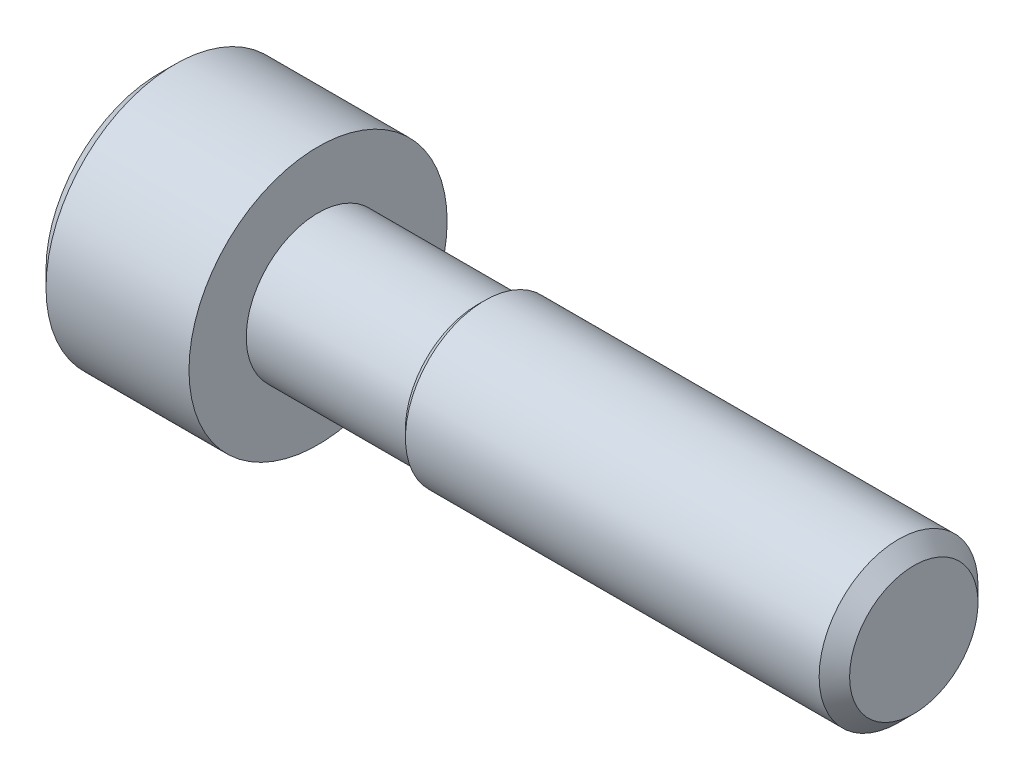
ISO-10303-21;
HEADER;
FILE_DESCRIPTION(('STEP AP214'),'2;1');
FILE_NAME('part.step','',(''),(''),'','','');
FILE_SCHEMA(('AUTOMOTIVE_DESIGN { 1 0 10303 214 1 1 1 1 }'));
ENDSEC;
DATA;
#1=APPLICATION_CONTEXT('core data for automotive mechanical design processes');
#2=APPLICATION_PROTOCOL_DEFINITION('international standard','automotive_design',2000,#1);
#3=PRODUCT_CONTEXT('',#1,'mechanical');
#4=PRODUCT('Part','Part','',(#3));
#5=PRODUCT_RELATED_PRODUCT_CATEGORY('part','',(#4));
#6=PRODUCT_DEFINITION_FORMATION('','',#4);
#7=PRODUCT_DEFINITION_CONTEXT('part definition',#1,'design');
#8=PRODUCT_DEFINITION('design','',#6,#7);
#9=PRODUCT_DEFINITION_SHAPE('','',#8);
#10=(LENGTH_UNIT() NAMED_UNIT(*) SI_UNIT(.MILLI.,.METRE.));
#11=(NAMED_UNIT(*) PLANE_ANGLE_UNIT() SI_UNIT($,.RADIAN.));
#12=(NAMED_UNIT(*) SI_UNIT($,.STERADIAN.) SOLID_ANGLE_UNIT());
#13=UNCERTAINTY_MEASURE_WITH_UNIT(LENGTH_MEASURE(1.E-05),#10,'distance_accuracy_value','');
#14=(GEOMETRIC_REPRESENTATION_CONTEXT(3) GLOBAL_UNCERTAINTY_ASSIGNED_CONTEXT((#13)) GLOBAL_UNIT_ASSIGNED_CONTEXT((#10,
#11,#12)) REPRESENTATION_CONTEXT('',''));
#15=CARTESIAN_POINT('',(0.,0.,0.));
#16=DIRECTION('',(0.,0.,1.));
#17=DIRECTION('',(1.,0.,0.));
#18=AXIS2_PLACEMENT_3D('',#15,#16,#17);
#19=CARTESIAN_POINT('',(-4.,0.,0.));
#20=DIRECTION('',(1.,0.,0.));
#21=DIRECTION('',(0.,0.,-1.));
#22=AXIS2_PLACEMENT_3D('',#19,#20,#21);
#23=PLANE('',#22);
#24=DIRECTION('',(0.,1.,0.));
#25=VECTOR('',#24,1.);
#26=CARTESIAN_POINT('',(-4.,0.,3.));
#27=LINE('',#26,#25);
#28=CARTESIAN_POINT('',(-4.,1.73205080756888,3.));
#29=VERTEX_POINT('',#28);
#30=CARTESIAN_POINT('',(-4.00000000000193,0.,3.00000000002137));
#31=VERTEX_POINT('',#30);
#32=EDGE_CURVE('E87',#29,#31,#27,.F.);
#33=ORIENTED_EDGE('',*,*,#32,.F.);
#34=DIRECTION('',(0.,-0.500000000000001,0.866025403784438));
#35=VECTOR('',#34,1.);
#36=CARTESIAN_POINT('',(-4.,2.59807621135332,1.5));
#37=LINE('',#36,#35);
#38=CARTESIAN_POINT('',(-4.00000000000193,2.59807621137183,1.50000000001069));
#39=VERTEX_POINT('',#38);
#40=EDGE_CURVE('E108',#39,#29,#37,.T.);
#41=ORIENTED_EDGE('',*,*,#40,.F.);
#42=CARTESIAN_POINT('',(-4.00000000000387,0.,0.));
#43=DIRECTION('',(-1.,0.,0.));
#44=DIRECTION('',(0.,0.,1.));
#45=AXIS2_PLACEMENT_3D('',#42,#43,#44);
#46=CIRCLE('',#45,3.00000000004275);
#47=EDGE_CURVE('E20',#39,#31,#46,.F.);
#48=ORIENTED_EDGE('',*,*,#47,.T.);
#49=EDGE_LOOP('',(#33,#41,#48));
#50=FACE_BOUND('',#49,.T.);
#51=ADVANCED_FACE('F17',(#50),#23,.F.);
#52=CARTESIAN_POINT('',(-4.,0.,0.));
#53=DIRECTION('',(1.,0.,0.));
#54=DIRECTION('',(0.,0.,-1.));
#55=AXIS2_PLACEMENT_3D('',#52,#53,#54);
#56=PLANE('',#55);
#57=DIRECTION('',(0.,-0.500000000000001,-0.866025403784438));
#58=VECTOR('',#57,1.);
#59=CARTESIAN_POINT('',(-4.,-1.73205080756888,3.));
#60=LINE('',#59,#58);
#61=CARTESIAN_POINT('',(-4.,-1.73205080756888,3.));
#62=VERTEX_POINT('',#61);
#63=CARTESIAN_POINT('',(-4.00000000000193,-2.59807621137183,1.50000000001069));
#64=VERTEX_POINT('',#63);
#65=EDGE_CURVE('E127',#62,#64,#60,.T.);
#66=ORIENTED_EDGE('',*,*,#65,.F.);
#67=DIRECTION('',(0.,1.,0.));
#68=VECTOR('',#67,1.);
#69=CARTESIAN_POINT('',(-4.,0.,3.));
#70=LINE('',#69,#68);
#71=EDGE_CURVE('E139',#31,#62,#70,.F.);
#72=ORIENTED_EDGE('',*,*,#71,.F.);
#73=CARTESIAN_POINT('',(-4.00000000000387,0.,0.));
#74=DIRECTION('',(-1.,0.,0.));
#75=DIRECTION('',(0.,0.,1.));
#76=AXIS2_PLACEMENT_3D('',#73,#74,#75);
#77=CIRCLE('',#76,3.00000000004275);
#78=EDGE_CURVE('E118',#31,#64,#77,.F.);
#79=ORIENTED_EDGE('',*,*,#78,.T.);
#80=EDGE_LOOP('',(#66,#72,#79));
#81=FACE_BOUND('',#80,.T.);
#82=ADVANCED_FACE('F252',(#81),#56,.F.);
#83=CARTESIAN_POINT('',(-4.,0.,0.));
#84=DIRECTION('',(1.,0.,0.));
#85=DIRECTION('',(0.,0.,-1.));
#86=AXIS2_PLACEMENT_3D('',#83,#84,#85);
#87=PLANE('',#86);
#88=DIRECTION('',(0.,0.500000000000001,0.866025403784438));
#89=VECTOR('',#88,1.);
#90=CARTESIAN_POINT('',(-4.,1.73205080756888,-3.));
#91=LINE('',#90,#89);
#92=CARTESIAN_POINT('',(-4.,1.73205080756888,-3.));
#93=VERTEX_POINT('',#92);
#94=CARTESIAN_POINT('',(-4.00000000000193,2.59807621137183,-1.50000000001069));
#95=VERTEX_POINT('',#94);
#96=EDGE_CURVE('E119',#93,#95,#91,.T.);
#97=ORIENTED_EDGE('',*,*,#96,.F.);
#98=DIRECTION('',(0.,1.,0.));
#99=VECTOR('',#98,1.);
#100=CARTESIAN_POINT('',(-4.,0.,-3.));
#101=LINE('',#100,#99);
#102=CARTESIAN_POINT('',(-4.00000000000193,0.,-3.00000000002137));
#103=VERTEX_POINT('',#102);
#104=EDGE_CURVE('E121',#103,#93,#101,.T.);
#105=ORIENTED_EDGE('',*,*,#104,.F.);
#106=CARTESIAN_POINT('',(-4.00000000000387,0.,0.));
#107=DIRECTION('',(-1.,0.,0.));
#108=DIRECTION('',(0.,0.,1.));
#109=AXIS2_PLACEMENT_3D('',#106,#107,#108);
#110=CIRCLE('',#109,3.00000000004275);
#111=EDGE_CURVE('E103',#103,#95,#110,.F.);
#112=ORIENTED_EDGE('',*,*,#111,.T.);
#113=EDGE_LOOP('',(#97,#105,#112));
#114=FACE_BOUND('',#113,.T.);
#115=ADVANCED_FACE('F254',(#114),#87,.F.);
#116=CARTESIAN_POINT('',(-3.99999999990541,0.,0.));
#117=DIRECTION('',(-1.,0.,0.));
#118=DIRECTION('',(0.,0.,1.));
#119=AXIS2_PLACEMENT_3D('',#116,#117,#118);
#120=CONICAL_SURFACE('',#119,2.99999999987222,1.04719755110239);
#121=CARTESIAN_POINT('',(-2.26794919242934,3.41060513164848E-10,0.));
#122=VERTEX_POINT('',#121);
#123=VERTEX_LOOP('',#122);
#124=FACE_BOUND('',#123,.T.);
#125=ORIENTED_EDGE('',*,*,#47,.F.);
#126=CARTESIAN_POINT('',(-4.00000000000387,0.,0.));
#127=DIRECTION('',(-1.,0.,0.));
#128=DIRECTION('',(0.,0.,1.));
#129=AXIS2_PLACEMENT_3D('',#126,#127,#128);
#130=CIRCLE('',#129,3.00000000004275);
#131=EDGE_CURVE('E93',#95,#39,#130,.F.);
#132=ORIENTED_EDGE('',*,*,#131,.F.);
#133=ORIENTED_EDGE('',*,*,#111,.F.);
#134=CARTESIAN_POINT('',(-4.00000000000387,0.,0.));
#135=DIRECTION('',(-1.,0.,0.));
#136=DIRECTION('',(0.,0.,1.));
#137=AXIS2_PLACEMENT_3D('',#134,#135,#136);
#138=CIRCLE('',#137,3.00000000004275);
#139=CARTESIAN_POINT('',(-4.00000000000193,-2.59807621137183,-1.50000000001069));
#140=VERTEX_POINT('',#139);
#141=EDGE_CURVE('E177',#103,#140,#138,.T.);
#142=ORIENTED_EDGE('',*,*,#141,.T.);
#143=CARTESIAN_POINT('',(-4.00000000000387,0.,0.));
#144=DIRECTION('',(-1.,0.,0.));
#145=DIRECTION('',(0.,0.,1.));
#146=AXIS2_PLACEMENT_3D('',#143,#144,#145);
#147=CIRCLE('',#146,3.00000000004275);
#148=EDGE_CURVE('E120',#64,#140,#147,.F.);
#149=ORIENTED_EDGE('',*,*,#148,.F.);
#150=ORIENTED_EDGE('',*,*,#78,.F.);
#151=EDGE_LOOP('',(#125,#132,#133,#142,#149,#150));
#152=FACE_BOUND('',#151,.T.);
#153=ADVANCED_FACE('F116',(#124,#152),#120,.F.);
#154=CARTESIAN_POINT('',(-4.,0.,0.));
#155=DIRECTION('',(1.,0.,0.));
#156=DIRECTION('',(0.,0.,-1.));
#157=AXIS2_PLACEMENT_3D('',#154,#155,#156);
#158=PLANE('',#157);
#159=DIRECTION('',(0.,1.,0.));
#160=VECTOR('',#159,1.);
#161=CARTESIAN_POINT('',(-4.,0.,-3.));
#162=LINE('',#161,#160);
#163=CARTESIAN_POINT('',(-4.,-1.73205080756888,-3.));
#164=VERTEX_POINT('',#163);
#165=EDGE_CURVE('E102',#164,#103,#162,.T.);
#166=ORIENTED_EDGE('',*,*,#165,.F.);
#167=DIRECTION('',(0.,0.5,-0.866025403784439));
#168=VECTOR('',#167,1.);
#169=CARTESIAN_POINT('',(-4.,-1.73205080756888,-3.));
#170=LINE('',#169,#168);
#171=EDGE_CURVE('E192',#164,#140,#170,.F.);
#172=ORIENTED_EDGE('',*,*,#171,.T.);
#173=ORIENTED_EDGE('',*,*,#141,.F.);
#174=EDGE_LOOP('',(#166,#172,#173));
#175=FACE_BOUND('',#174,.T.);
#176=ADVANCED_FACE('F193',(#175),#158,.F.);
#177=CARTESIAN_POINT('',(-4.,0.,0.));
#178=DIRECTION('',(1.,0.,0.));
#179=DIRECTION('',(0.,0.,-1.));
#180=AXIS2_PLACEMENT_3D('',#177,#178,#179);
#181=PLANE('',#180);
#182=DIRECTION('',(0.,0.5,-0.866025403784439));
#183=VECTOR('',#182,1.);
#184=CARTESIAN_POINT('',(-4.,-1.73205080756888,-3.));
#185=LINE('',#184,#183);
#186=CARTESIAN_POINT('',(-4.,-3.46410161513775,0.));
#187=VERTEX_POINT('',#186);
#188=EDGE_CURVE('E186',#140,#187,#185,.F.);
#189=ORIENTED_EDGE('',*,*,#188,.T.);
#190=DIRECTION('',(0.,-0.5,-0.866025403784439));
#191=VECTOR('',#190,1.);
#192=CARTESIAN_POINT('',(-4.,-3.46410161513775,0.));
#193=LINE('',#192,#191);
#194=EDGE_CURVE('E179',#187,#64,#193,.F.);
#195=ORIENTED_EDGE('',*,*,#194,.T.);
#196=ORIENTED_EDGE('',*,*,#148,.T.);
#197=EDGE_LOOP('',(#189,#195,#196));
#198=FACE_BOUND('',#197,.T.);
#199=ADVANCED_FACE('F184',(#198),#181,.F.);
#200=CARTESIAN_POINT('',(-4.,0.,0.));
#201=DIRECTION('',(1.,0.,0.));
#202=DIRECTION('',(0.,0.,-1.));
#203=AXIS2_PLACEMENT_3D('',#200,#201,#202);
#204=PLANE('',#203);
#205=DIRECTION('',(0.,-0.5,0.866025403784439));
#206=VECTOR('',#205,1.);
#207=CARTESIAN_POINT('',(-4.,1.73205080756888,3.));
#208=LINE('',#207,#206);
#209=CARTESIAN_POINT('',(-4.,3.46410161513775,0.));
#210=VERTEX_POINT('',#209);
#211=EDGE_CURVE('E96',#39,#210,#208,.F.);
#212=ORIENTED_EDGE('',*,*,#211,.T.);
#213=DIRECTION('',(0.,0.5,0.866025403784439));
#214=VECTOR('',#213,1.);
#215=CARTESIAN_POINT('',(-4.,3.46410161513775,0.));
#216=LINE('',#215,#214);
#217=EDGE_CURVE('E98',#210,#95,#216,.F.);
#218=ORIENTED_EDGE('',*,*,#217,.T.);
#219=ORIENTED_EDGE('',*,*,#131,.T.);
#220=EDGE_LOOP('',(#212,#218,#219));
#221=FACE_BOUND('',#220,.T.);
#222=ADVANCED_FACE('F95',(#221),#204,.F.);
#223=CARTESIAN_POINT('',(-8.,-3.46410161513775,0.));
#224=DIRECTION('',(0.,-0.866025403784439,0.5));
#225=DIRECTION('',(0.,-0.5,-0.866025403784439));
#226=AXIS2_PLACEMENT_3D('',#223,#224,#225);
#227=PLANE('',#226);
#228=DIRECTION('',(1.,0.,0.));
#229=VECTOR('',#228,1.);
#230=CARTESIAN_POINT('',(-8.,-1.73205080756888,3.));
#231=LINE('',#230,#229);
#232=CARTESIAN_POINT('',(-8.,-1.73205080756888,3.));
#233=VERTEX_POINT('',#232);
#234=EDGE_CURVE('E153',#233,#62,#231,.T.);
#235=ORIENTED_EDGE('',*,*,#234,.T.);
#236=ORIENTED_EDGE('',*,*,#65,.T.);
#237=ORIENTED_EDGE('',*,*,#194,.F.);
#238=DIRECTION('',(1.,0.,0.));
#239=VECTOR('',#238,1.);
#240=CARTESIAN_POINT('',(-8.,-3.46410161513776,0.));
#241=LINE('',#240,#239);
#242=CARTESIAN_POINT('',(-8.,-3.46410161513775,0.));
#243=VERTEX_POINT('',#242);
#244=EDGE_CURVE('E201',#187,#243,#241,.F.);
#245=ORIENTED_EDGE('',*,*,#244,.T.);
#246=DIRECTION('',(0.,-0.499999999999998,-0.86602540378444));
#247=VECTOR('',#246,1.);
#248=CARTESIAN_POINT('',(-8.,-1.73205080756888,3.));
#249=LINE('',#248,#247);
#250=EDGE_CURVE('E159',#233,#243,#249,.T.);
#251=ORIENTED_EDGE('',*,*,#250,.F.);
#252=EDGE_LOOP('',(#235,#236,#237,#245,#251));
#253=FACE_BOUND('',#252,.T.);
#254=ADVANCED_FACE('F248',(#253),#227,.F.);
#255=CARTESIAN_POINT('',(-8.,-1.73205080756888,-3.));
#256=DIRECTION('',(0.,-0.866025403784439,-0.5));
#257=DIRECTION('',(0.,0.5,-0.866025403784439));
#258=AXIS2_PLACEMENT_3D('',#255,#256,#257);
#259=PLANE('',#258);
#260=ORIENTED_EDGE('',*,*,#244,.F.);
#261=ORIENTED_EDGE('',*,*,#188,.F.);
#262=ORIENTED_EDGE('',*,*,#171,.F.);
#263=DIRECTION('',(-1.,0.,0.));
#264=VECTOR('',#263,1.);
#265=CARTESIAN_POINT('',(-8.,-1.73205080756888,-3.));
#266=LINE('',#265,#264);
#267=CARTESIAN_POINT('',(-8.,-1.73205080756888,-3.));
#268=VERTEX_POINT('',#267);
#269=EDGE_CURVE('E203',#164,#268,#266,.T.);
#270=ORIENTED_EDGE('',*,*,#269,.T.);
#271=DIRECTION('',(0.,0.499999999999998,-0.86602540378444));
#272=VECTOR('',#271,1.);
#273=CARTESIAN_POINT('',(-8.,-3.46410161513775,0.));
#274=LINE('',#273,#272);
#275=EDGE_CURVE('E240',#243,#268,#274,.T.);
#276=ORIENTED_EDGE('',*,*,#275,.F.);
#277=EDGE_LOOP('',(#260,#261,#262,#270,#276));
#278=FACE_BOUND('',#277,.T.);
#279=ADVANCED_FACE('F199',(#278),#259,.F.);
#280=CARTESIAN_POINT('',(-8.,1.73205080756888,-3.));
#281=DIRECTION('',(0.,0.,-1.));
#282=DIRECTION('',(-1.,0.,0.));
#283=AXIS2_PLACEMENT_3D('',#280,#281,#282);
#284=PLANE('',#283);
#285=ORIENTED_EDGE('',*,*,#269,.F.);
#286=ORIENTED_EDGE('',*,*,#165,.T.);
#287=ORIENTED_EDGE('',*,*,#104,.T.);
#288=DIRECTION('',(1.,0.,0.));
#289=VECTOR('',#288,1.);
#290=CARTESIAN_POINT('',(-8.,1.73205080756887,-3.));
#291=LINE('',#290,#289);
#292=CARTESIAN_POINT('',(-8.,1.73205080756888,-3.));
#293=VERTEX_POINT('',#292);
#294=EDGE_CURVE('E110',#93,#293,#291,.F.);
#295=ORIENTED_EDGE('',*,*,#294,.T.);
#296=DIRECTION('',(0.,1.,0.));
#297=VECTOR('',#296,1.);
#298=CARTESIAN_POINT('',(-8.,4.35,-3.));
#299=LINE('',#298,#297);
#300=EDGE_CURVE('E238',#268,#293,#299,.T.);
#301=ORIENTED_EDGE('',*,*,#300,.F.);
#302=EDGE_LOOP('',(#285,#286,#287,#295,#301));
#303=FACE_BOUND('',#302,.T.);
#304=ADVANCED_FACE('F308',(#303),#284,.F.);
#305=CARTESIAN_POINT('',(-8.,3.46410161513775,0.));
#306=DIRECTION('',(0.,0.866025403784439,-0.5));
#307=DIRECTION('',(0.,0.5,0.866025403784439));
#308=AXIS2_PLACEMENT_3D('',#305,#306,#307);
#309=PLANE('',#308);
#310=ORIENTED_EDGE('',*,*,#294,.F.);
#311=ORIENTED_EDGE('',*,*,#96,.T.);
#312=ORIENTED_EDGE('',*,*,#217,.F.);
#313=DIRECTION('',(1.,0.,0.));
#314=VECTOR('',#313,1.);
#315=CARTESIAN_POINT('',(-8.,3.46410161513776,0.));
#316=LINE('',#315,#314);
#317=CARTESIAN_POINT('',(-8.,3.46410161513775,0.));
#318=VERTEX_POINT('',#317);
#319=EDGE_CURVE('E109',#210,#318,#316,.F.);
#320=ORIENTED_EDGE('',*,*,#319,.T.);
#321=DIRECTION('',(0.,0.499999999999998,0.86602540378444));
#322=VECTOR('',#321,1.);
#323=CARTESIAN_POINT('',(-8.,1.73205080756888,-3.));
#324=LINE('',#323,#322);
#325=EDGE_CURVE('E229',#293,#318,#324,.T.);
#326=ORIENTED_EDGE('',*,*,#325,.F.);
#327=EDGE_LOOP('',(#310,#311,#312,#320,#326));
#328=FACE_BOUND('',#327,.T.);
#329=ADVANCED_FACE('F227',(#328),#309,.F.);
#330=CARTESIAN_POINT('',(-8.,1.73205080756888,3.));
#331=DIRECTION('',(0.,0.866025403784439,0.5));
#332=DIRECTION('',(0.,-0.5,0.866025403784439));
#333=AXIS2_PLACEMENT_3D('',#330,#331,#332);
#334=PLANE('',#333);
#335=ORIENTED_EDGE('',*,*,#319,.F.);
#336=ORIENTED_EDGE('',*,*,#211,.F.);
#337=ORIENTED_EDGE('',*,*,#40,.T.);
#338=DIRECTION('',(1.,0.,0.));
#339=VECTOR('',#338,1.);
#340=CARTESIAN_POINT('',(-8.,1.73205080756888,3.));
#341=LINE('',#340,#339);
#342=CARTESIAN_POINT('',(-8.,1.73205080756888,3.));
#343=VERTEX_POINT('',#342);
#344=EDGE_CURVE('E35',#29,#343,#341,.F.);
#345=ORIENTED_EDGE('',*,*,#344,.T.);
#346=DIRECTION('',(0.,-0.499999999999998,0.86602540378444));
#347=VECTOR('',#346,1.);
#348=CARTESIAN_POINT('',(-8.,3.46410161513775,0.));
#349=LINE('',#348,#347);
#350=EDGE_CURVE('E232',#318,#343,#349,.T.);
#351=ORIENTED_EDGE('',*,*,#350,.F.);
#352=EDGE_LOOP('',(#335,#336,#337,#345,#351));
#353=FACE_BOUND('',#352,.T.);
#354=ADVANCED_FACE('F107',(#353),#334,.F.);
#355=CARTESIAN_POINT('',(-8.,-1.73205080756888,3.));
#356=DIRECTION('',(0.,0.,1.));
#357=DIRECTION('',(1.,0.,0.));
#358=AXIS2_PLACEMENT_3D('',#355,#356,#357);
#359=PLANE('',#358);
#360=ORIENTED_EDGE('',*,*,#344,.F.);
#361=ORIENTED_EDGE('',*,*,#32,.T.);
#362=ORIENTED_EDGE('',*,*,#71,.T.);
#363=ORIENTED_EDGE('',*,*,#234,.F.);
#364=DIRECTION('',(0.,1.,0.));
#365=VECTOR('',#364,1.);
#366=CARTESIAN_POINT('',(-8.,4.35,3.));
#367=LINE('',#366,#365);
#368=EDGE_CURVE('E176',#343,#233,#367,.F.);
#369=ORIENTED_EDGE('',*,*,#368,.F.);
#370=EDGE_LOOP('',(#360,#361,#362,#363,#369));
#371=FACE_BOUND('',#370,.T.);
#372=ADVANCED_FACE('F250',(#371),#359,.F.);
#373=CARTESIAN_POINT('',(-8.,4.35,0.));
#374=DIRECTION('',(-1.,0.,0.));
#375=DIRECTION('',(0.,0.,1.));
#376=AXIS2_PLACEMENT_3D('',#373,#374,#375);
#377=PLANE('',#376);
#378=CARTESIAN_POINT('',(-8.00000000009504,0.,0.));
#379=DIRECTION('',(1.,0.,0.));
#380=DIRECTION('',(0.,0.,-1.));
#381=AXIS2_PLACEMENT_3D('',#378,#379,#380);
#382=CIRCLE('',#381,5.69999999999027);
#383=CARTESIAN_POINT('',(-8.00000000009504,0.,-5.69999999999027));
#384=VERTEX_POINT('',#383);
#385=EDGE_CURVE('E173',#384,#384,#382,.T.);
#386=ORIENTED_EDGE('',*,*,#385,.F.);
#387=EDGE_LOOP('',(#386));
#388=FACE_BOUND('',#387,.T.);
#389=ORIENTED_EDGE('',*,*,#350,.T.);
#390=ORIENTED_EDGE('',*,*,#368,.T.);
#391=ORIENTED_EDGE('',*,*,#250,.T.);
#392=ORIENTED_EDGE('',*,*,#275,.T.);
#393=ORIENTED_EDGE('',*,*,#300,.T.);
#394=ORIENTED_EDGE('',*,*,#325,.T.);
#395=EDGE_LOOP('',(#389,#390,#391,#392,#393,#394));
#396=FACE_BOUND('',#395,.T.);
#397=ADVANCED_FACE('F236',(#388,#396),#377,.T.);
#398=CARTESIAN_POINT('',(-7.20000000001164,0.,0.));
#399=DIRECTION('',(1.,0.,0.));
#400=DIRECTION('',(0.,0.,-1.));
#401=AXIS2_PLACEMENT_3D('',#398,#399,#400);
#402=CONICAL_SURFACE('',#401,6.50000000007367,0.785398163397448);
#403=ORIENTED_EDGE('',*,*,#385,.T.);
#404=EDGE_LOOP('',(#403));
#405=FACE_BOUND('',#404,.T.);
#406=CARTESIAN_POINT('',(-7.2,0.,0.));
#407=DIRECTION('',(1.,0.,0.));
#408=DIRECTION('',(0.,0.,-1.));
#409=AXIS2_PLACEMENT_3D('',#406,#407,#408);
#410=CIRCLE('',#409,6.5);
#411=CARTESIAN_POINT('',(-7.2,0.,-6.5));
#412=VERTEX_POINT('',#411);
#413=EDGE_CURVE('E172',#412,#412,#410,.T.);
#414=ORIENTED_EDGE('',*,*,#413,.F.);
#415=EDGE_LOOP('',(#414));
#416=FACE_BOUND('',#415,.T.);
#417=ADVANCED_FACE('F294',(#405,#416),#402,.T.);
#418=CARTESIAN_POINT('',(-3.6,0.,0.));
#419=DIRECTION('',(1.,0.,0.));
#420=DIRECTION('',(0.,0.,-1.));
#421=AXIS2_PLACEMENT_3D('',#418,#419,#420);
#422=CYLINDRICAL_SURFACE('',#421,6.5);
#423=ORIENTED_EDGE('',*,*,#413,.T.);
#424=EDGE_LOOP('',(#423));
#425=FACE_BOUND('',#424,.T.);
#426=CARTESIAN_POINT('',(0.,0.,0.));
#427=DIRECTION('',(1.,0.,0.));
#428=DIRECTION('',(0.,0.,-1.));
#429=AXIS2_PLACEMENT_3D('',#426,#427,#428);
#430=CIRCLE('',#429,6.5);
#431=CARTESIAN_POINT('',(0.,0.,-6.5));
#432=VERTEX_POINT('',#431);
#433=EDGE_CURVE('E169',#432,#432,#430,.T.);
#434=ORIENTED_EDGE('',*,*,#433,.F.);
#435=EDGE_LOOP('',(#434));
#436=FACE_BOUND('',#435,.T.);
#437=ADVANCED_FACE('F290',(#425,#436),#422,.T.);
#438=CARTESIAN_POINT('',(0.,5.058020375,0.));
#439=DIRECTION('',(1.,0.,0.));
#440=DIRECTION('',(0.,1.,0.));
#441=AXIS2_PLACEMENT_3D('',#438,#439,#440);
#442=PLANE('',#441);
#443=CARTESIAN_POINT('',(0.,0.,0.));
#444=DIRECTION('',(1.,0.,0.));
#445=DIRECTION('',(0.,0.,-1.));
#446=AXIS2_PLACEMENT_3D('',#443,#444,#445);
#447=CIRCLE('',#446,3.61604075);
#448=CARTESIAN_POINT('',(0.,0.,-3.61604075));
#449=VERTEX_POINT('',#448);
#450=EDGE_CURVE('E166',#449,#449,#447,.T.);
#451=ORIENTED_EDGE('',*,*,#450,.F.);
#452=EDGE_LOOP('',(#451));
#453=FACE_BOUND('',#452,.T.);
#454=ORIENTED_EDGE('',*,*,#433,.T.);
#455=EDGE_LOOP('',(#454));
#456=FACE_BOUND('',#455,.T.);
#457=ADVANCED_FACE('F286',(#453,#456),#442,.T.);
#458=CARTESIAN_POINT('',(30.,1.6165,0.));
#459=DIRECTION('',(1.,0.,0.));
#460=DIRECTION('',(0.,0.,-1.));
#461=AXIS2_PLACEMENT_3D('',#458,#459,#460);
#462=PLANE('',#461);
#463=CARTESIAN_POINT('',(30.0000000000296,0.,0.));
#464=DIRECTION('',(-1.,0.,0.));
#465=DIRECTION('',(0.,0.,1.));
#466=AXIS2_PLACEMENT_3D('',#463,#464,#465);
#467=CIRCLE('',#466,3.23299999996607);
#468=CARTESIAN_POINT('',(30.0000000000296,0.,3.23299999996607));
#469=VERTEX_POINT('',#468);
#470=EDGE_CURVE('E162',#469,#469,#467,.T.);
#471=ORIENTED_EDGE('',*,*,#470,.F.);
#472=EDGE_LOOP('',(#471));
#473=FACE_BOUND('',#472,.T.);
#474=ADVANCED_FACE('F282',(#473),#462,.T.);
#475=CARTESIAN_POINT('',(4.008020375,0.,0.));
#476=DIRECTION('',(1.,0.,0.));
#477=DIRECTION('',(0.,0.,-1.));
#478=AXIS2_PLACEMENT_3D('',#475,#476,#477);
#479=CYLINDRICAL_SURFACE('',#478,3.61604075);
#480=CARTESIAN_POINT('',(8.01604074996476,0.,0.));
#481=DIRECTION('',(1.,0.,0.));
#482=DIRECTION('',(0.,1.,0.));
#483=AXIS2_PLACEMENT_3D('',#480,#481,#482);
#484=CIRCLE('',#483,3.61604074998922);
#485=CARTESIAN_POINT('',(8.01604074996476,3.61604074998922,0.));
#486=VERTEX_POINT('',#485);
#487=EDGE_CURVE('E165',#486,#486,#484,.T.);
#488=ORIENTED_EDGE('',*,*,#487,.F.);
#489=EDGE_LOOP('',(#488));
#490=FACE_BOUND('',#489,.T.);
#491=ORIENTED_EDGE('',*,*,#450,.T.);
#492=EDGE_LOOP('',(#491));
#493=FACE_BOUND('',#492,.T.);
#494=ADVANCED_FACE('F278',(#490,#493),#479,.T.);
#495=CARTESIAN_POINT('',(29.2329999999765,0.,0.));
#496=DIRECTION('',(-1.,0.,0.));
#497=DIRECTION('',(0.,0.,1.));
#498=AXIS2_PLACEMENT_3D('',#495,#496,#497);
#499=CONICAL_SURFACE('',#498,3.99999999996226,0.785398163360393);
#500=ORIENTED_EDGE('',*,*,#470,.T.);
#501=EDGE_LOOP('',(#500));
#502=FACE_BOUND('',#501,.T.);
#503=CARTESIAN_POINT('',(29.233,0.,0.));
#504=DIRECTION('',(1.,0.,0.));
#505=DIRECTION('',(0.,0.,-1.));
#506=AXIS2_PLACEMENT_3D('',#503,#504,#505);
#507=CIRCLE('',#506,4.);
#508=CARTESIAN_POINT('',(29.233,0.,-4.));
#509=VERTEX_POINT('',#508);
#510=EDGE_CURVE('E26',#509,#509,#507,.F.);
#511=ORIENTED_EDGE('',*,*,#510,.F.);
#512=EDGE_LOOP('',(#511));
#513=FACE_BOUND('',#512,.T.);
#514=ADVANCED_FACE('F270',(#502,#513),#499,.T.);
#515=CARTESIAN_POINT('',(8.39999999999463,0.,0.));
#516=DIRECTION('',(1.,0.,0.));
#517=DIRECTION('',(0.,0.,-1.));
#518=AXIS2_PLACEMENT_3D('',#515,#516,#517);
#519=CONICAL_SURFACE('',#518,4.0000000000191,0.785398163397448);
#520=ORIENTED_EDGE('',*,*,#487,.T.);
#521=EDGE_LOOP('',(#520));
#522=FACE_BOUND('',#521,.T.);
#523=CARTESIAN_POINT('',(8.4,0.,0.));
#524=DIRECTION('',(1.,0.,0.));
#525=DIRECTION('',(0.,0.,-1.));
#526=AXIS2_PLACEMENT_3D('',#523,#524,#525);
#527=CIRCLE('',#526,4.);
#528=CARTESIAN_POINT('',(8.4,0.,-4.));
#529=VERTEX_POINT('',#528);
#530=EDGE_CURVE('E11',#529,#529,#527,.T.);
#531=ORIENTED_EDGE('',*,*,#530,.F.);
#532=EDGE_LOOP('',(#531));
#533=FACE_BOUND('',#532,.T.);
#534=ADVANCED_FACE('F264',(#522,#533),#519,.T.);
#535=CARTESIAN_POINT('',(18.8165,0.,0.));
#536=DIRECTION('',(1.,0.,0.));
#537=DIRECTION('',(0.,0.,-1.));
#538=AXIS2_PLACEMENT_3D('',#535,#536,#537);
#539=CYLINDRICAL_SURFACE('',#538,4.);
#540=ORIENTED_EDGE('',*,*,#510,.T.);
#541=EDGE_LOOP('',(#540));
#542=FACE_BOUND('',#541,.T.);
#543=ORIENTED_EDGE('',*,*,#530,.T.);
#544=EDGE_LOOP('',(#543));
#545=FACE_BOUND('',#544,.T.);
#546=ADVANCED_FACE('F262',(#542,#545),#539,.T.);
#547=CLOSED_SHELL('',(#51,#82,#115,#153,#176,#199,#222,#254,#279,#304,#329,#354,#372,#397,#417,
#437,#457,#474,#494,#514,#534,#546));
#548=MANIFOLD_SOLID_BREP('B1',#547);
#549=ADVANCED_BREP_SHAPE_REPRESENTATION('',(#18,#548),#14);
#550=SHAPE_DEFINITION_REPRESENTATION(#9,#549);
ENDSEC;
END-ISO-10303-21;
